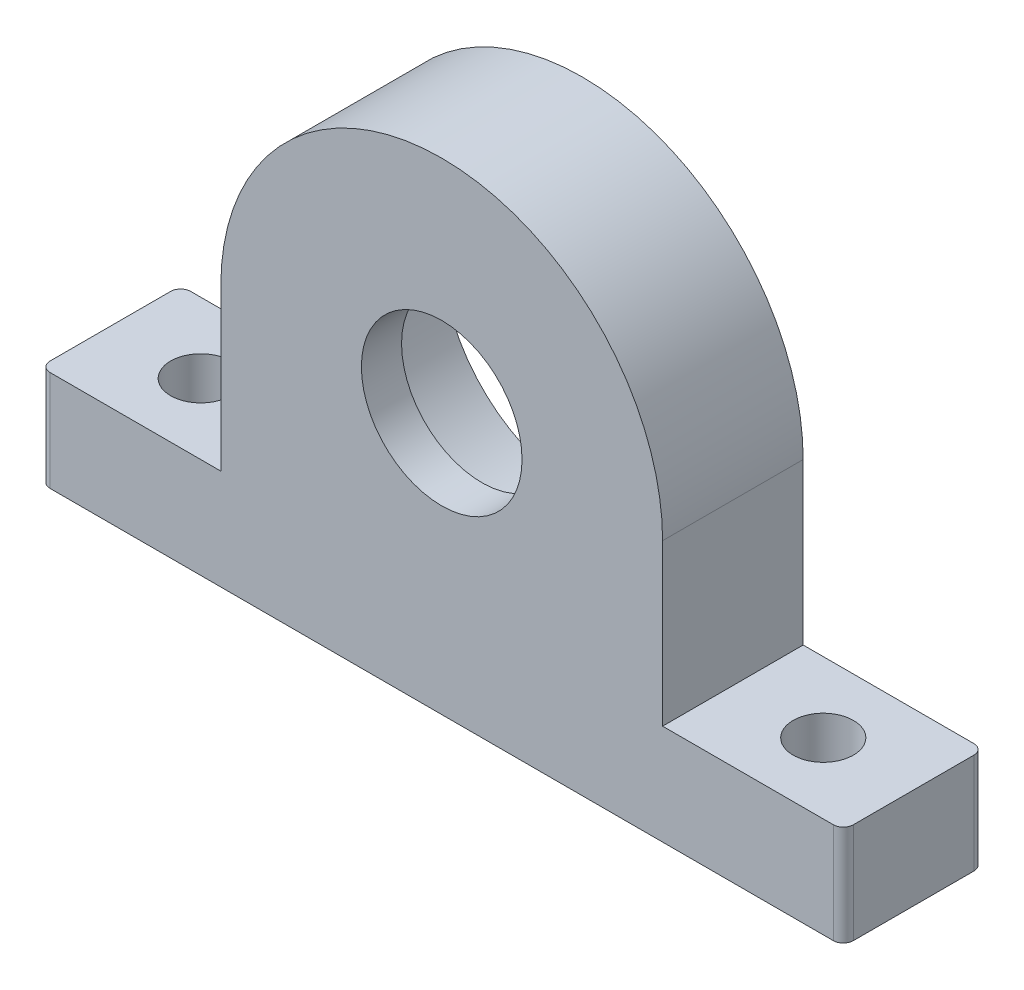
ISO-10303-21;
HEADER;
FILE_DESCRIPTION(('STEP AP214'),'2;1');
FILE_NAME('part.step','',(''),(''),'','','');
FILE_SCHEMA(('AUTOMOTIVE_DESIGN { 1 0 10303 214 1 1 1 1 }'));
ENDSEC;
DATA;
#1=APPLICATION_CONTEXT('core data for automotive mechanical design processes');
#2=APPLICATION_PROTOCOL_DEFINITION('international standard','automotive_design',2000,#1);
#3=PRODUCT_CONTEXT('',#1,'mechanical');
#4=PRODUCT('Part','Part','',(#3));
#5=PRODUCT_RELATED_PRODUCT_CATEGORY('part','',(#4));
#6=PRODUCT_DEFINITION_FORMATION('','',#4);
#7=PRODUCT_DEFINITION_CONTEXT('part definition',#1,'design');
#8=PRODUCT_DEFINITION('design','',#6,#7);
#9=PRODUCT_DEFINITION_SHAPE('','',#8);
#10=(LENGTH_UNIT() NAMED_UNIT(*) SI_UNIT(.MILLI.,.METRE.));
#11=(NAMED_UNIT(*) PLANE_ANGLE_UNIT() SI_UNIT($,.RADIAN.));
#12=(NAMED_UNIT(*) SI_UNIT($,.STERADIAN.) SOLID_ANGLE_UNIT());
#13=UNCERTAINTY_MEASURE_WITH_UNIT(LENGTH_MEASURE(1.E-05),#10,'distance_accuracy_value','');
#14=(GEOMETRIC_REPRESENTATION_CONTEXT(3) GLOBAL_UNCERTAINTY_ASSIGNED_CONTEXT((#13)) GLOBAL_UNIT_ASSIGNED_CONTEXT((#10,
#11,#12)) REPRESENTATION_CONTEXT('',''));
#15=CARTESIAN_POINT('',(0.,0.,0.));
#16=DIRECTION('',(0.,0.,1.));
#17=DIRECTION('',(1.,0.,0.));
#18=AXIS2_PLACEMENT_3D('',#15,#16,#17);
#19=CARTESIAN_POINT('',(0.,0.,7.));
#20=DIRECTION('',(0.,0.,-1.));
#21=DIRECTION('',(-1.,0.,0.));
#22=AXIS2_PLACEMENT_3D('',#19,#20,#21);
#23=CYLINDRICAL_SURFACE('',#22,4.);
#24=CARTESIAN_POINT('',(0.,0.,7.));
#25=DIRECTION('',(0.,0.,1.));
#26=DIRECTION('',(1.,0.,0.));
#27=AXIS2_PLACEMENT_3D('',#24,#25,#26);
#28=CIRCLE('',#27,4.);
#29=CARTESIAN_POINT('',(4.,0.,7.));
#30=VERTEX_POINT('',#29);
#31=EDGE_CURVE('E176',#30,#30,#28,.T.);
#32=ORIENTED_EDGE('',*,*,#31,.T.);
#33=EDGE_LOOP('',(#32));
#34=FACE_BOUND('',#33,.T.);
#35=CARTESIAN_POINT('',(0.,0.,5.));
#36=DIRECTION('',(0.,0.,-1.));
#37=DIRECTION('',(-1.,0.,0.));
#38=AXIS2_PLACEMENT_3D('',#35,#36,#37);
#39=CIRCLE('',#38,4.);
#40=CARTESIAN_POINT('',(-4.,0.,5.));
#41=VERTEX_POINT('',#40);
#42=EDGE_CURVE('E185',#41,#41,#39,.T.);
#43=ORIENTED_EDGE('',*,*,#42,.T.);
#44=EDGE_LOOP('',(#43));
#45=FACE_BOUND('',#44,.T.);
#46=ADVANCED_FACE('F42',(#34,#45),#23,.F.);
#47=CARTESIAN_POINT('',(0.,-13.,7.));
#48=DIRECTION('',(0.,1.,0.));
#49=DIRECTION('',(-1.,0.,0.));
#50=AXIS2_PLACEMENT_3D('',#47,#48,#49);
#51=PLANE('',#50);
#52=CARTESIAN_POINT('',(-15.5,-13.,3.5));
#53=DIRECTION('',(0.,1.,0.));
#54=DIRECTION('',(0.,0.,1.));
#55=AXIS2_PLACEMENT_3D('',#52,#53,#54);
#56=CIRCLE('',#55,1.5);
#57=CARTESIAN_POINT('',(-15.5,-13.,5.));
#58=VERTEX_POINT('',#57);
#59=EDGE_CURVE('E284',#58,#58,#56,.T.);
#60=ORIENTED_EDGE('',*,*,#59,.T.);
#61=EDGE_LOOP('',(#60));
#62=FACE_BOUND('',#61,.T.);
#63=CARTESIAN_POINT('',(15.5,-13.,3.5));
#64=DIRECTION('',(0.,1.,0.));
#65=DIRECTION('',(0.,0.,-1.));
#66=AXIS2_PLACEMENT_3D('',#63,#64,#65);
#67=CIRCLE('',#66,1.5);
#68=CARTESIAN_POINT('',(15.5,-13.,2.));
#69=VERTEX_POINT('',#68);
#70=EDGE_CURVE('E276',#69,#69,#67,.T.);
#71=ORIENTED_EDGE('',*,*,#70,.T.);
#72=EDGE_LOOP('',(#71));
#73=FACE_BOUND('',#72,.T.);
#74=DIRECTION('',(0.,0.,-1.));
#75=VECTOR('',#74,1.);
#76=CARTESIAN_POINT('',(20.,-13.,7.));
#77=LINE('',#76,#75);
#78=CARTESIAN_POINT('',(20.,-13.,6.5));
#79=VERTEX_POINT('',#78);
#80=CARTESIAN_POINT('',(20.,-13.,0.5));
#81=VERTEX_POINT('',#80);
#82=EDGE_CURVE('E219',#79,#81,#77,.T.);
#83=ORIENTED_EDGE('',*,*,#82,.F.);
#84=CARTESIAN_POINT('',(19.5,-13.,6.5));
#85=DIRECTION('',(0.,1.,0.));
#86=DIRECTION('',(-1.,0.,0.));
#87=AXIS2_PLACEMENT_3D('',#84,#85,#86);
#88=CIRCLE('',#87,0.5);
#89=CARTESIAN_POINT('',(19.5,-13.,7.));
#90=VERTEX_POINT('',#89);
#91=EDGE_CURVE('E242',#79,#90,#88,.F.);
#92=ORIENTED_EDGE('',*,*,#91,.T.);
#93=DIRECTION('',(1.,0.,0.));
#94=VECTOR('',#93,1.);
#95=CARTESIAN_POINT('',(0.,-13.,7.));
#96=LINE('',#95,#94);
#97=CARTESIAN_POINT('',(-19.5,-13.,7.));
#98=VERTEX_POINT('',#97);
#99=EDGE_CURVE('E156',#98,#90,#96,.T.);
#100=ORIENTED_EDGE('',*,*,#99,.F.);
#101=CARTESIAN_POINT('',(-19.5,-13.,6.5));
#102=DIRECTION('',(0.,1.,0.));
#103=DIRECTION('',(-1.,0.,0.));
#104=AXIS2_PLACEMENT_3D('',#101,#102,#103);
#105=CIRCLE('',#104,0.5);
#106=CARTESIAN_POINT('',(-20.,-13.,6.5));
#107=VERTEX_POINT('',#106);
#108=EDGE_CURVE('E237',#98,#107,#105,.F.);
#109=ORIENTED_EDGE('',*,*,#108,.T.);
#110=DIRECTION('',(0.,0.,-1.));
#111=VECTOR('',#110,1.);
#112=CARTESIAN_POINT('',(-20.,-13.,7.));
#113=LINE('',#112,#111);
#114=CARTESIAN_POINT('',(-20.,-13.,0.5));
#115=VERTEX_POINT('',#114);
#116=EDGE_CURVE('E180',#107,#115,#113,.T.);
#117=ORIENTED_EDGE('',*,*,#116,.T.);
#118=CARTESIAN_POINT('',(-19.5,-13.,0.5));
#119=DIRECTION('',(0.,1.,0.));
#120=DIRECTION('',(-1.,0.,0.));
#121=AXIS2_PLACEMENT_3D('',#118,#119,#120);
#122=CIRCLE('',#121,0.5);
#123=CARTESIAN_POINT('',(-19.5,-13.,0.));
#124=VERTEX_POINT('',#123);
#125=EDGE_CURVE('E234',#115,#124,#122,.F.);
#126=ORIENTED_EDGE('',*,*,#125,.T.);
#127=DIRECTION('',(1.,0.,0.));
#128=VECTOR('',#127,1.);
#129=CARTESIAN_POINT('',(0.,-13.,0.));
#130=LINE('',#129,#128);
#131=CARTESIAN_POINT('',(19.5,-13.,0.));
#132=VERTEX_POINT('',#131);
#133=EDGE_CURVE('E181',#124,#132,#130,.T.);
#134=ORIENTED_EDGE('',*,*,#133,.T.);
#135=CARTESIAN_POINT('',(19.5,-13.,0.5));
#136=DIRECTION('',(0.,1.,0.));
#137=DIRECTION('',(-1.,0.,0.));
#138=AXIS2_PLACEMENT_3D('',#135,#136,#137);
#139=CIRCLE('',#138,0.5);
#140=EDGE_CURVE('E240',#132,#81,#139,.F.);
#141=ORIENTED_EDGE('',*,*,#140,.T.);
#142=EDGE_LOOP('',(#83,#92,#100,#109,#117,#126,#134,#141));
#143=FACE_BOUND('',#142,.T.);
#144=ADVANCED_FACE('F299',(#62,#73,#143),#51,.F.);
#145=CARTESIAN_POINT('',(20.,0.,7.));
#146=DIRECTION('',(1.,0.,0.));
#147=DIRECTION('',(0.,0.,-1.));
#148=AXIS2_PLACEMENT_3D('',#145,#146,#147);
#149=PLANE('',#148);
#150=DIRECTION('',(0.,0.,-1.));
#151=VECTOR('',#150,1.);
#152=CARTESIAN_POINT('',(20.,-7.99999999999999,7.));
#153=LINE('',#152,#151);
#154=CARTESIAN_POINT('',(20.,-7.99999999999999,6.5));
#155=VERTEX_POINT('',#154);
#156=CARTESIAN_POINT('',(20.,-7.99999999999999,0.5));
#157=VERTEX_POINT('',#156);
#158=EDGE_CURVE('E144',#155,#157,#153,.T.);
#159=ORIENTED_EDGE('',*,*,#158,.F.);
#160=DIRECTION('',(0.,-1.,0.));
#161=VECTOR('',#160,1.);
#162=CARTESIAN_POINT('',(20.,0.,6.5));
#163=LINE('',#162,#161);
#164=EDGE_CURVE('E230',#155,#79,#163,.T.);
#165=ORIENTED_EDGE('',*,*,#164,.T.);
#166=ORIENTED_EDGE('',*,*,#82,.T.);
#167=DIRECTION('',(0.,-1.,0.));
#168=VECTOR('',#167,1.);
#169=CARTESIAN_POINT('',(20.,-7.99999999999999,0.5));
#170=LINE('',#169,#168);
#171=EDGE_CURVE('E223',#81,#157,#170,.F.);
#172=ORIENTED_EDGE('',*,*,#171,.T.);
#173=EDGE_LOOP('',(#159,#165,#166,#172));
#174=FACE_BOUND('',#173,.T.);
#175=ADVANCED_FACE('F328',(#174),#149,.T.);
#176=CARTESIAN_POINT('',(0.,-8.,7.));
#177=DIRECTION('',(0.,1.,0.));
#178=DIRECTION('',(-1.,0.,0.));
#179=AXIS2_PLACEMENT_3D('',#176,#177,#178);
#180=PLANE('',#179);
#181=CARTESIAN_POINT('',(15.5,-8.,3.5));
#182=DIRECTION('',(0.,1.,0.));
#183=DIRECTION('',(0.,0.,-1.));
#184=AXIS2_PLACEMENT_3D('',#181,#182,#183);
#185=CIRCLE('',#184,1.5);
#186=CARTESIAN_POINT('',(15.5,-8.,2.));
#187=VERTEX_POINT('',#186);
#188=EDGE_CURVE('E279',#187,#187,#185,.T.);
#189=ORIENTED_EDGE('',*,*,#188,.F.);
#190=EDGE_LOOP('',(#189));
#191=FACE_BOUND('',#190,.T.);
#192=DIRECTION('',(1.,0.,0.));
#193=VECTOR('',#192,1.);
#194=CARTESIAN_POINT('',(0.,-8.,7.));
#195=LINE('',#194,#193);
#196=CARTESIAN_POINT('',(11.,-8.,7.));
#197=VERTEX_POINT('',#196);
#198=CARTESIAN_POINT('',(19.5,-7.99999999999999,7.));
#199=VERTEX_POINT('',#198);
#200=EDGE_CURVE('E135',#197,#199,#195,.T.);
#201=ORIENTED_EDGE('',*,*,#200,.T.);
#202=CARTESIAN_POINT('',(19.5,-7.99999999999999,6.5));
#203=DIRECTION('',(0.,1.,0.));
#204=DIRECTION('',(-1.,0.,0.));
#205=AXIS2_PLACEMENT_3D('',#202,#203,#204);
#206=CIRCLE('',#205,0.5);
#207=EDGE_CURVE('E254',#199,#155,#206,.T.);
#208=ORIENTED_EDGE('',*,*,#207,.T.);
#209=ORIENTED_EDGE('',*,*,#158,.T.);
#210=CARTESIAN_POINT('',(19.5,-7.99999999999999,0.5));
#211=DIRECTION('',(0.,1.,0.));
#212=DIRECTION('',(-1.,0.,0.));
#213=AXIS2_PLACEMENT_3D('',#210,#211,#212);
#214=CIRCLE('',#213,0.5);
#215=CARTESIAN_POINT('',(19.5,-7.99999999999999,0.));
#216=VERTEX_POINT('',#215);
#217=EDGE_CURVE('E251',#157,#216,#214,.T.);
#218=ORIENTED_EDGE('',*,*,#217,.T.);
#219=DIRECTION('',(1.,0.,0.));
#220=VECTOR('',#219,1.);
#221=CARTESIAN_POINT('',(0.,-8.,0.));
#222=LINE('',#221,#220);
#223=CARTESIAN_POINT('',(11.,-8.,0.));
#224=VERTEX_POINT('',#223);
#225=EDGE_CURVE('E138',#224,#216,#222,.T.);
#226=ORIENTED_EDGE('',*,*,#225,.F.);
#227=DIRECTION('',(0.,0.,-1.));
#228=VECTOR('',#227,1.);
#229=CARTESIAN_POINT('',(11.,-8.,7.));
#230=LINE('',#229,#228);
#231=EDGE_CURVE('E132',#197,#224,#230,.T.);
#232=ORIENTED_EDGE('',*,*,#231,.F.);
#233=EDGE_LOOP('',(#201,#208,#209,#218,#226,#232));
#234=FACE_BOUND('',#233,.T.);
#235=ADVANCED_FACE('F134',(#191,#234),#180,.T.);
#236=CARTESIAN_POINT('',(11.,0.,7.));
#237=DIRECTION('',(1.,0.,0.));
#238=DIRECTION('',(0.,1.,0.));
#239=AXIS2_PLACEMENT_3D('',#236,#237,#238);
#240=PLANE('',#239);
#241=DIRECTION('',(0.,-1.,0.));
#242=VECTOR('',#241,1.);
#243=CARTESIAN_POINT('',(11.,0.,0.));
#244=LINE('',#243,#242);
#245=CARTESIAN_POINT('',(11.,0.,0.));
#246=VERTEX_POINT('',#245);
#247=EDGE_CURVE('E188',#246,#224,#244,.T.);
#248=ORIENTED_EDGE('',*,*,#247,.F.);
#249=DIRECTION('',(0.,0.,-1.));
#250=VECTOR('',#249,1.);
#251=CARTESIAN_POINT('',(11.,0.,7.));
#252=LINE('',#251,#250);
#253=CARTESIAN_POINT('',(11.,0.,7.));
#254=VERTEX_POINT('',#253);
#255=EDGE_CURVE('E145',#254,#246,#252,.T.);
#256=ORIENTED_EDGE('',*,*,#255,.F.);
#257=DIRECTION('',(0.,-1.,0.));
#258=VECTOR('',#257,1.);
#259=CARTESIAN_POINT('',(11.,0.,7.));
#260=LINE('',#259,#258);
#261=EDGE_CURVE('E152',#254,#197,#260,.T.);
#262=ORIENTED_EDGE('',*,*,#261,.T.);
#263=ORIENTED_EDGE('',*,*,#231,.T.);
#264=EDGE_LOOP('',(#248,#256,#262,#263));
#265=FACE_BOUND('',#264,.T.);
#266=ADVANCED_FACE('F158',(#265),#240,.T.);
#267=CARTESIAN_POINT('',(0.,0.,7.));
#268=DIRECTION('',(0.,0.,-1.));
#269=DIRECTION('',(-1.,0.,0.));
#270=AXIS2_PLACEMENT_3D('',#267,#268,#269);
#271=CYLINDRICAL_SURFACE('',#270,11.);
#272=CARTESIAN_POINT('',(0.,0.,0.));
#273=DIRECTION('',(0.,0.,1.));
#274=DIRECTION('',(1.,0.,0.));
#275=AXIS2_PLACEMENT_3D('',#272,#273,#274);
#276=CIRCLE('',#275,11.);
#277=CARTESIAN_POINT('',(-11.,0.,0.));
#278=VERTEX_POINT('',#277);
#279=EDGE_CURVE('E191',#246,#278,#276,.T.);
#280=ORIENTED_EDGE('',*,*,#279,.T.);
#281=DIRECTION('',(0.,0.,-1.));
#282=VECTOR('',#281,1.);
#283=CARTESIAN_POINT('',(-11.,0.,7.));
#284=LINE('',#283,#282);
#285=CARTESIAN_POINT('',(-11.,0.,7.));
#286=VERTEX_POINT('',#285);
#287=EDGE_CURVE('E210',#286,#278,#284,.T.);
#288=ORIENTED_EDGE('',*,*,#287,.F.);
#289=CARTESIAN_POINT('',(0.,0.,7.));
#290=DIRECTION('',(0.,0.,1.));
#291=DIRECTION('',(1.,0.,0.));
#292=AXIS2_PLACEMENT_3D('',#289,#290,#291);
#293=CIRCLE('',#292,11.);
#294=EDGE_CURVE('E161',#254,#286,#293,.T.);
#295=ORIENTED_EDGE('',*,*,#294,.F.);
#296=ORIENTED_EDGE('',*,*,#255,.T.);
#297=EDGE_LOOP('',(#280,#288,#295,#296));
#298=FACE_BOUND('',#297,.T.);
#299=ADVANCED_FACE('F379',(#298),#271,.T.);
#300=CARTESIAN_POINT('',(-11.,0.,7.));
#301=DIRECTION('',(1.,0.,0.));
#302=DIRECTION('',(0.,1.,0.));
#303=AXIS2_PLACEMENT_3D('',#300,#301,#302);
#304=PLANE('',#303);
#305=DIRECTION('',(0.,-1.,0.));
#306=VECTOR('',#305,1.);
#307=CARTESIAN_POINT('',(-11.,0.,0.));
#308=LINE('',#307,#306);
#309=CARTESIAN_POINT('',(-11.,-8.,0.));
#310=VERTEX_POINT('',#309);
#311=EDGE_CURVE('E194',#278,#310,#308,.T.);
#312=ORIENTED_EDGE('',*,*,#311,.T.);
#313=DIRECTION('',(0.,0.,-1.));
#314=VECTOR('',#313,1.);
#315=CARTESIAN_POINT('',(-11.,-8.,7.));
#316=LINE('',#315,#314);
#317=CARTESIAN_POINT('',(-11.,-8.,7.));
#318=VERTEX_POINT('',#317);
#319=EDGE_CURVE('E206',#318,#310,#316,.T.);
#320=ORIENTED_EDGE('',*,*,#319,.F.);
#321=DIRECTION('',(0.,-1.,0.));
#322=VECTOR('',#321,1.);
#323=CARTESIAN_POINT('',(-11.,0.,7.));
#324=LINE('',#323,#322);
#325=EDGE_CURVE('E166',#286,#318,#324,.T.);
#326=ORIENTED_EDGE('',*,*,#325,.F.);
#327=ORIENTED_EDGE('',*,*,#287,.T.);
#328=EDGE_LOOP('',(#312,#320,#326,#327));
#329=FACE_BOUND('',#328,.T.);
#330=ADVANCED_FACE('F312',(#329),#304,.F.);
#331=CARTESIAN_POINT('',(0.,-8.,7.));
#332=DIRECTION('',(0.,-1.,0.));
#333=DIRECTION('',(0.,0.,-1.));
#334=AXIS2_PLACEMENT_3D('',#331,#332,#333);
#335=PLANE('',#334);
#336=CARTESIAN_POINT('',(-15.5,-8.,3.5));
#337=DIRECTION('',(0.,1.,0.));
#338=DIRECTION('',(0.,0.,1.));
#339=AXIS2_PLACEMENT_3D('',#336,#337,#338);
#340=CIRCLE('',#339,1.5);
#341=CARTESIAN_POINT('',(-15.5,-8.,5.));
#342=VERTEX_POINT('',#341);
#343=EDGE_CURVE('E278',#342,#342,#340,.T.);
#344=ORIENTED_EDGE('',*,*,#343,.F.);
#345=EDGE_LOOP('',(#344));
#346=FACE_BOUND('',#345,.T.);
#347=DIRECTION('',(0.,0.,-1.));
#348=VECTOR('',#347,1.);
#349=CARTESIAN_POINT('',(-20.,-8.,7.));
#350=LINE('',#349,#348);
#351=CARTESIAN_POINT('',(-20.,-8.,6.5));
#352=VERTEX_POINT('',#351);
#353=CARTESIAN_POINT('',(-20.,-8.,0.5));
#354=VERTEX_POINT('',#353);
#355=EDGE_CURVE('E203',#352,#354,#350,.T.);
#356=ORIENTED_EDGE('',*,*,#355,.F.);
#357=CARTESIAN_POINT('',(-19.5,-8.,6.5));
#358=DIRECTION('',(0.,-1.,0.));
#359=DIRECTION('',(0.,0.,-1.));
#360=AXIS2_PLACEMENT_3D('',#357,#358,#359);
#361=CIRCLE('',#360,0.5);
#362=CARTESIAN_POINT('',(-19.5,-8.,7.));
#363=VERTEX_POINT('',#362);
#364=EDGE_CURVE('E11',#352,#363,#361,.F.);
#365=ORIENTED_EDGE('',*,*,#364,.T.);
#366=DIRECTION('',(-1.,0.,0.));
#367=VECTOR('',#366,1.);
#368=CARTESIAN_POINT('',(0.,-8.,7.));
#369=LINE('',#368,#367);
#370=EDGE_CURVE('E172',#318,#363,#369,.T.);
#371=ORIENTED_EDGE('',*,*,#370,.F.);
#372=ORIENTED_EDGE('',*,*,#319,.T.);
#373=DIRECTION('',(-1.,0.,0.));
#374=VECTOR('',#373,1.);
#375=CARTESIAN_POINT('',(0.,-8.,0.));
#376=LINE('',#375,#374);
#377=CARTESIAN_POINT('',(-19.5,-8.,0.));
#378=VERTEX_POINT('',#377);
#379=EDGE_CURVE('E197',#310,#378,#376,.T.);
#380=ORIENTED_EDGE('',*,*,#379,.T.);
#381=CARTESIAN_POINT('',(-19.5,-8.,0.5));
#382=DIRECTION('',(0.,-1.,0.));
#383=DIRECTION('',(0.,0.,-1.));
#384=AXIS2_PLACEMENT_3D('',#381,#382,#383);
#385=CIRCLE('',#384,0.5);
#386=EDGE_CURVE('E51',#378,#354,#385,.F.);
#387=ORIENTED_EDGE('',*,*,#386,.T.);
#388=EDGE_LOOP('',(#356,#365,#371,#372,#380,#387));
#389=FACE_BOUND('',#388,.T.);
#390=ADVANCED_FACE('F309',(#346,#389),#335,.F.);
#391=CARTESIAN_POINT('',(-20.,0.,7.));
#392=DIRECTION('',(1.,0.,0.));
#393=DIRECTION('',(0.,0.,-1.));
#394=AXIS2_PLACEMENT_3D('',#391,#392,#393);
#395=PLANE('',#394);
#396=ORIENTED_EDGE('',*,*,#116,.F.);
#397=DIRECTION('',(0.,-1.,0.));
#398=VECTOR('',#397,1.);
#399=CARTESIAN_POINT('',(-20.,-8.,6.5));
#400=LINE('',#399,#398);
#401=EDGE_CURVE('E64',#107,#352,#400,.F.);
#402=ORIENTED_EDGE('',*,*,#401,.T.);
#403=ORIENTED_EDGE('',*,*,#355,.T.);
#404=DIRECTION('',(0.,-1.,0.));
#405=VECTOR('',#404,1.);
#406=CARTESIAN_POINT('',(-20.,0.,0.5));
#407=LINE('',#406,#405);
#408=EDGE_CURVE('E264',#354,#115,#407,.T.);
#409=ORIENTED_EDGE('',*,*,#408,.T.);
#410=EDGE_LOOP('',(#396,#402,#403,#409));
#411=FACE_BOUND('',#410,.T.);
#412=ADVANCED_FACE('F311',(#411),#395,.F.);
#413=CARTESIAN_POINT('',(0.,0.,7.));
#414=DIRECTION('',(0.,0.,1.));
#415=DIRECTION('',(1.,0.,0.));
#416=AXIS2_PLACEMENT_3D('',#413,#414,#415);
#417=PLANE('',#416);
#418=ORIENTED_EDGE('',*,*,#99,.T.);
#419=DIRECTION('',(0.,-1.,0.));
#420=VECTOR('',#419,1.);
#421=CARTESIAN_POINT('',(19.5,0.,7.));
#422=LINE('',#421,#420);
#423=EDGE_CURVE('E154',#90,#199,#422,.F.);
#424=ORIENTED_EDGE('',*,*,#423,.T.);
#425=ORIENTED_EDGE('',*,*,#200,.F.);
#426=ORIENTED_EDGE('',*,*,#261,.F.);
#427=ORIENTED_EDGE('',*,*,#294,.T.);
#428=ORIENTED_EDGE('',*,*,#325,.T.);
#429=ORIENTED_EDGE('',*,*,#370,.T.);
#430=DIRECTION('',(0.,-1.,0.));
#431=VECTOR('',#430,1.);
#432=CARTESIAN_POINT('',(-19.5,-13.,7.));
#433=LINE('',#432,#431);
#434=EDGE_CURVE('E245',#363,#98,#433,.T.);
#435=ORIENTED_EDGE('',*,*,#434,.T.);
#436=EDGE_LOOP('',(#418,#424,#425,#426,#427,#428,#429,#435));
#437=FACE_BOUND('',#436,.T.);
#438=ORIENTED_EDGE('',*,*,#31,.F.);
#439=EDGE_LOOP('',(#438));
#440=FACE_BOUND('',#439,.T.);
#441=ADVANCED_FACE('F150',(#437,#440),#417,.T.);
#442=CARTESIAN_POINT('',(0.,0.,0.));
#443=DIRECTION('',(0.,0.,1.));
#444=DIRECTION('',(1.,0.,0.));
#445=AXIS2_PLACEMENT_3D('',#442,#443,#444);
#446=PLANE('',#445);
#447=CARTESIAN_POINT('',(0.,0.,0.));
#448=DIRECTION('',(0.,0.,-1.));
#449=DIRECTION('',(-1.,0.,0.));
#450=AXIS2_PLACEMENT_3D('',#447,#448,#449);
#451=CIRCLE('',#450,7.);
#452=CARTESIAN_POINT('',(-7.,0.,0.));
#453=VERTEX_POINT('',#452);
#454=EDGE_CURVE('E272',#453,#453,#451,.T.);
#455=ORIENTED_EDGE('',*,*,#454,.F.);
#456=EDGE_LOOP('',(#455));
#457=FACE_BOUND('',#456,.T.);
#458=ORIENTED_EDGE('',*,*,#225,.T.);
#459=DIRECTION('',(0.,-1.,0.));
#460=VECTOR('',#459,1.);
#461=CARTESIAN_POINT('',(19.5,-13.,0.));
#462=LINE('',#461,#460);
#463=EDGE_CURVE('E260',#216,#132,#462,.T.);
#464=ORIENTED_EDGE('',*,*,#463,.T.);
#465=ORIENTED_EDGE('',*,*,#133,.F.);
#466=DIRECTION('',(0.,-1.,0.));
#467=VECTOR('',#466,1.);
#468=CARTESIAN_POINT('',(-19.5,0.,0.));
#469=LINE('',#468,#467);
#470=EDGE_CURVE('E257',#124,#378,#469,.F.);
#471=ORIENTED_EDGE('',*,*,#470,.T.);
#472=ORIENTED_EDGE('',*,*,#379,.F.);
#473=ORIENTED_EDGE('',*,*,#311,.F.);
#474=ORIENTED_EDGE('',*,*,#279,.F.);
#475=ORIENTED_EDGE('',*,*,#247,.T.);
#476=EDGE_LOOP('',(#458,#464,#465,#471,#472,#473,#474,#475));
#477=FACE_BOUND('',#476,.T.);
#478=ADVANCED_FACE('F336',(#457,#477),#446,.F.);
#479=CARTESIAN_POINT('',(0.,0.,5.));
#480=DIRECTION('',(0.,0.,-1.));
#481=DIRECTION('',(-1.,0.,0.));
#482=AXIS2_PLACEMENT_3D('',#479,#480,#481);
#483=CYLINDRICAL_SURFACE('',#482,7.);
#484=CARTESIAN_POINT('',(0.,0.,5.));
#485=DIRECTION('',(0.,0.,-1.));
#486=DIRECTION('',(-1.,0.,0.));
#487=AXIS2_PLACEMENT_3D('',#484,#485,#486);
#488=CIRCLE('',#487,7.);
#489=CARTESIAN_POINT('',(-7.,0.,5.));
#490=VERTEX_POINT('',#489);
#491=EDGE_CURVE('E227',#490,#490,#488,.T.);
#492=ORIENTED_EDGE('',*,*,#491,.F.);
#493=EDGE_LOOP('',(#492));
#494=FACE_BOUND('',#493,.T.);
#495=ORIENTED_EDGE('',*,*,#454,.T.);
#496=EDGE_LOOP('',(#495));
#497=FACE_BOUND('',#496,.T.);
#498=ADVANCED_FACE('F355',(#494,#497),#483,.F.);
#499=CARTESIAN_POINT('',(0.,0.,5.));
#500=DIRECTION('',(0.,0.,-1.));
#501=DIRECTION('',(-1.,0.,0.));
#502=AXIS2_PLACEMENT_3D('',#499,#500,#501);
#503=PLANE('',#502);
#504=ORIENTED_EDGE('',*,*,#42,.F.);
#505=EDGE_LOOP('',(#504));
#506=FACE_BOUND('',#505,.T.);
#507=ORIENTED_EDGE('',*,*,#491,.T.);
#508=EDGE_LOOP('',(#507));
#509=FACE_BOUND('',#508,.T.);
#510=ADVANCED_FACE('F305',(#506,#509),#503,.T.);
#511=CARTESIAN_POINT('',(-15.5,-13.,3.5));
#512=DIRECTION('',(0.,1.,0.));
#513=DIRECTION('',(0.,0.,1.));
#514=AXIS2_PLACEMENT_3D('',#511,#512,#513);
#515=CYLINDRICAL_SURFACE('',#514,1.5);
#516=ORIENTED_EDGE('',*,*,#59,.F.);
#517=EDGE_LOOP('',(#516));
#518=FACE_BOUND('',#517,.T.);
#519=ORIENTED_EDGE('',*,*,#343,.T.);
#520=EDGE_LOOP('',(#519));
#521=FACE_BOUND('',#520,.T.);
#522=ADVANCED_FACE('F301',(#518,#521),#515,.F.);
#523=CARTESIAN_POINT('',(15.5,-13.,3.5));
#524=DIRECTION('',(0.,1.,0.));
#525=DIRECTION('',(0.,0.,1.));
#526=AXIS2_PLACEMENT_3D('',#523,#524,#525);
#527=CYLINDRICAL_SURFACE('',#526,1.5);
#528=ORIENTED_EDGE('',*,*,#70,.F.);
#529=EDGE_LOOP('',(#528));
#530=FACE_BOUND('',#529,.T.);
#531=ORIENTED_EDGE('',*,*,#188,.T.);
#532=EDGE_LOOP('',(#531));
#533=FACE_BOUND('',#532,.T.);
#534=ADVANCED_FACE('F304',(#530,#533),#527,.F.);
#535=CARTESIAN_POINT('',(19.5,0.,6.5));
#536=DIRECTION('',(0.,-1.,0.));
#537=DIRECTION('',(0.,0.,-1.));
#538=AXIS2_PLACEMENT_3D('',#535,#536,#537);
#539=CYLINDRICAL_SURFACE('',#538,0.5);
#540=ORIENTED_EDGE('',*,*,#207,.F.);
#541=ORIENTED_EDGE('',*,*,#423,.F.);
#542=ORIENTED_EDGE('',*,*,#91,.F.);
#543=ORIENTED_EDGE('',*,*,#164,.F.);
#544=EDGE_LOOP('',(#540,#541,#542,#543));
#545=FACE_BOUND('',#544,.T.);
#546=ADVANCED_FACE('F325',(#545),#539,.T.);
#547=CARTESIAN_POINT('',(19.5,0.,0.5));
#548=DIRECTION('',(0.,1.,0.));
#549=DIRECTION('',(0.,0.,1.));
#550=AXIS2_PLACEMENT_3D('',#547,#548,#549);
#551=CYLINDRICAL_SURFACE('',#550,0.5);
#552=ORIENTED_EDGE('',*,*,#217,.F.);
#553=ORIENTED_EDGE('',*,*,#171,.F.);
#554=ORIENTED_EDGE('',*,*,#140,.F.);
#555=ORIENTED_EDGE('',*,*,#463,.F.);
#556=EDGE_LOOP('',(#552,#553,#554,#555));
#557=FACE_BOUND('',#556,.T.);
#558=ADVANCED_FACE('F333',(#557),#551,.T.);
#559=CARTESIAN_POINT('',(-19.5,0.,6.5));
#560=DIRECTION('',(0.,1.,0.));
#561=DIRECTION('',(0.,0.,1.));
#562=AXIS2_PLACEMENT_3D('',#559,#560,#561);
#563=CYLINDRICAL_SURFACE('',#562,0.5);
#564=ORIENTED_EDGE('',*,*,#364,.F.);
#565=ORIENTED_EDGE('',*,*,#401,.F.);
#566=ORIENTED_EDGE('',*,*,#108,.F.);
#567=ORIENTED_EDGE('',*,*,#434,.F.);
#568=EDGE_LOOP('',(#564,#565,#566,#567));
#569=FACE_BOUND('',#568,.T.);
#570=ADVANCED_FACE('F319',(#569),#563,.T.);
#571=CARTESIAN_POINT('',(-19.5,0.,0.5));
#572=DIRECTION('',(0.,-1.,0.));
#573=DIRECTION('',(0.,0.,-1.));
#574=AXIS2_PLACEMENT_3D('',#571,#572,#573);
#575=CYLINDRICAL_SURFACE('',#574,0.5);
#576=ORIENTED_EDGE('',*,*,#386,.F.);
#577=ORIENTED_EDGE('',*,*,#470,.F.);
#578=ORIENTED_EDGE('',*,*,#125,.F.);
#579=ORIENTED_EDGE('',*,*,#408,.F.);
#580=EDGE_LOOP('',(#576,#577,#578,#579));
#581=FACE_BOUND('',#580,.T.);
#582=ADVANCED_FACE('F44',(#581),#575,.T.);
#583=CLOSED_SHELL('',(#46,#144,#175,#235,#266,#299,#330,#390,#412,#441,#478,#498,#510,#522,#534,
#546,#558,#570,#582));
#584=MANIFOLD_SOLID_BREP('B2',#583);
#585=ADVANCED_BREP_SHAPE_REPRESENTATION('',(#18,#584),#14);
#586=SHAPE_DEFINITION_REPRESENTATION(#9,#585);
ENDSEC;
END-ISO-10303-21;
